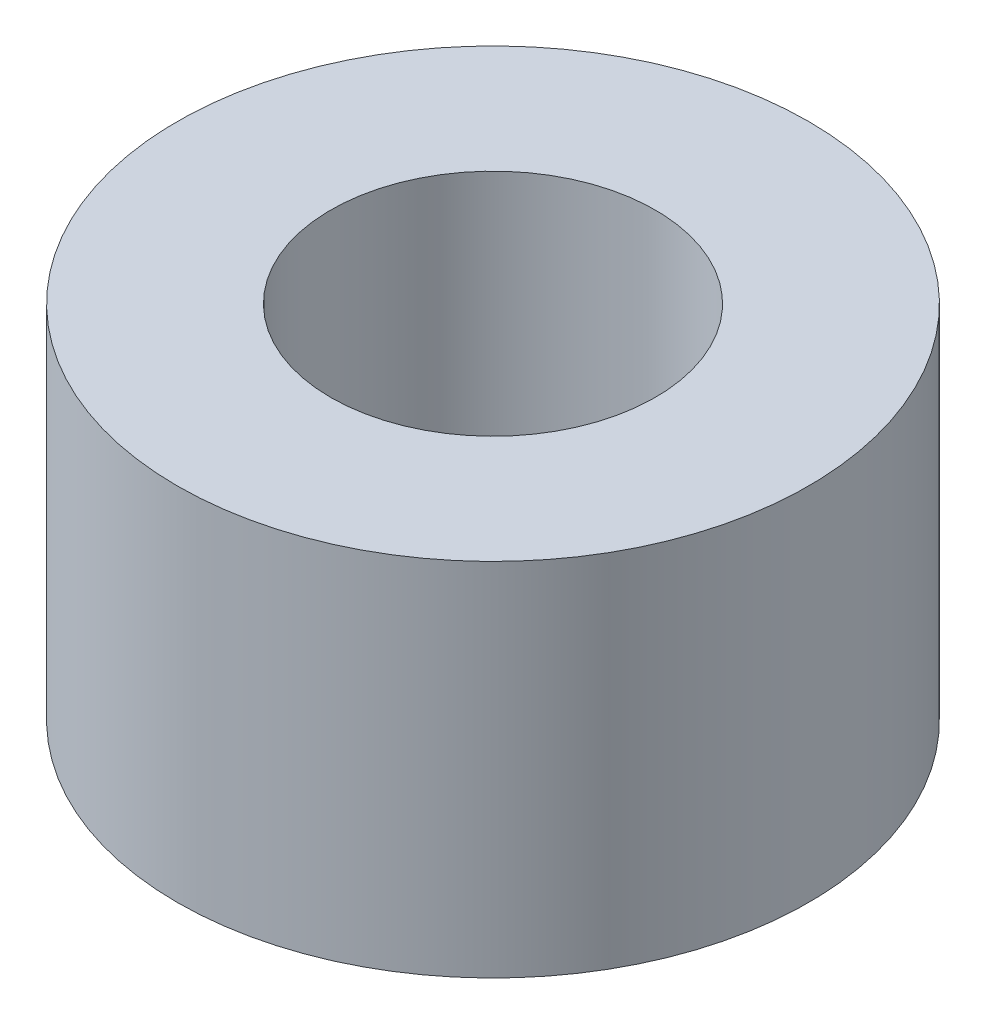
ISO-10303-21;
HEADER;
FILE_DESCRIPTION(('STEP AP214'),'2;1');
FILE_NAME('part.step','',(''),(''),'','','');
FILE_SCHEMA(('AUTOMOTIVE_DESIGN { 1 0 10303 214 1 1 1 1 }'));
ENDSEC;
DATA;
#1=APPLICATION_CONTEXT('core data for automotive mechanical design processes');
#2=APPLICATION_PROTOCOL_DEFINITION('international standard','automotive_design',2000,#1);
#3=PRODUCT_CONTEXT('',#1,'mechanical');
#4=PRODUCT('Part','Part','',(#3));
#5=PRODUCT_RELATED_PRODUCT_CATEGORY('part','',(#4));
#6=PRODUCT_DEFINITION_FORMATION('','',#4);
#7=PRODUCT_DEFINITION_CONTEXT('part definition',#1,'design');
#8=PRODUCT_DEFINITION('design','',#6,#7);
#9=PRODUCT_DEFINITION_SHAPE('','',#8);
#10=(LENGTH_UNIT() NAMED_UNIT(*) SI_UNIT(.MILLI.,.METRE.));
#11=(NAMED_UNIT(*) PLANE_ANGLE_UNIT() SI_UNIT($,.RADIAN.));
#12=(NAMED_UNIT(*) SI_UNIT($,.STERADIAN.) SOLID_ANGLE_UNIT());
#13=UNCERTAINTY_MEASURE_WITH_UNIT(LENGTH_MEASURE(1.E-05),#10,'distance_accuracy_value','');
#14=(GEOMETRIC_REPRESENTATION_CONTEXT(3) GLOBAL_UNCERTAINTY_ASSIGNED_CONTEXT((#13)) GLOBAL_UNIT_ASSIGNED_CONTEXT((#10,
#11,#12)) REPRESENTATION_CONTEXT('',''));
#15=CARTESIAN_POINT('',(0.,0.,0.));
#16=DIRECTION('',(0.,0.,1.));
#17=DIRECTION('',(1.,0.,0.));
#18=AXIS2_PLACEMENT_3D('',#15,#16,#17);
#19=CARTESIAN_POINT('',(0.,4.,0.));
#20=DIRECTION('',(0.,1.,0.));
#21=DIRECTION('',(0.,0.,1.));
#22=AXIS2_PLACEMENT_3D('',#19,#20,#21);
#23=PLANE('',#22);
#24=CARTESIAN_POINT('',(0.,4.,0.));
#25=DIRECTION('',(0.,1.,0.));
#26=DIRECTION('',(0.,0.,1.));
#27=AXIS2_PLACEMENT_3D('',#24,#25,#26);
#28=CIRCLE('',#27,3.5);
#29=CARTESIAN_POINT('',(0.,4.,3.5));
#30=VERTEX_POINT('',#29);
#31=EDGE_CURVE('E10',#30,#30,#28,.T.);
#32=ORIENTED_EDGE('',*,*,#31,.T.);
#33=EDGE_LOOP('',(#32));
#34=FACE_BOUND('',#33,.T.);
#35=CARTESIAN_POINT('',(0.,4.,0.));
#36=DIRECTION('',(0.,1.,0.));
#37=DIRECTION('',(0.,0.,1.));
#38=AXIS2_PLACEMENT_3D('',#35,#36,#37);
#39=CIRCLE('',#38,1.8);
#40=CARTESIAN_POINT('',(0.,4.,1.8));
#41=VERTEX_POINT('',#40);
#42=EDGE_CURVE('E50',#41,#41,#39,.T.);
#43=ORIENTED_EDGE('',*,*,#42,.F.);
#44=EDGE_LOOP('',(#43));
#45=FACE_BOUND('',#44,.T.);
#46=ADVANCED_FACE('F37',(#34,#45),#23,.T.);
#47=CARTESIAN_POINT('',(0.,0.,0.));
#48=DIRECTION('',(0.,1.,0.));
#49=DIRECTION('',(0.,0.,1.));
#50=AXIS2_PLACEMENT_3D('',#47,#48,#49);
#51=PLANE('',#50);
#52=CARTESIAN_POINT('',(0.,0.,0.));
#53=DIRECTION('',(0.,1.,0.));
#54=DIRECTION('',(0.,0.,1.));
#55=AXIS2_PLACEMENT_3D('',#52,#53,#54);
#56=CIRCLE('',#55,3.5);
#57=CARTESIAN_POINT('',(0.,0.,3.5));
#58=VERTEX_POINT('',#57);
#59=EDGE_CURVE('E41',#58,#58,#56,.T.);
#60=ORIENTED_EDGE('',*,*,#59,.F.);
#61=EDGE_LOOP('',(#60));
#62=FACE_BOUND('',#61,.T.);
#63=CARTESIAN_POINT('',(0.,0.,0.));
#64=DIRECTION('',(0.,1.,0.));
#65=DIRECTION('',(0.,0.,1.));
#66=AXIS2_PLACEMENT_3D('',#63,#64,#65);
#67=CIRCLE('',#66,1.8);
#68=CARTESIAN_POINT('',(0.,0.,1.8));
#69=VERTEX_POINT('',#68);
#70=EDGE_CURVE('E52',#69,#69,#67,.T.);
#71=ORIENTED_EDGE('',*,*,#70,.T.);
#72=EDGE_LOOP('',(#71));
#73=FACE_BOUND('',#72,.T.);
#74=ADVANCED_FACE('F64',(#62,#73),#51,.F.);
#75=CARTESIAN_POINT('',(0.,4.,0.));
#76=DIRECTION('',(0.,-1.,0.));
#77=DIRECTION('',(0.,0.,-1.));
#78=AXIS2_PLACEMENT_3D('',#75,#76,#77);
#79=CYLINDRICAL_SURFACE('',#78,3.5);
#80=ORIENTED_EDGE('',*,*,#31,.F.);
#81=EDGE_LOOP('',(#80));
#82=FACE_BOUND('',#81,.T.);
#83=ORIENTED_EDGE('',*,*,#59,.T.);
#84=EDGE_LOOP('',(#83));
#85=FACE_BOUND('',#84,.T.);
#86=ADVANCED_FACE('F39',(#82,#85),#79,.T.);
#87=CARTESIAN_POINT('',(0.,4.,0.));
#88=DIRECTION('',(0.,-1.,0.));
#89=DIRECTION('',(0.,0.,-1.));
#90=AXIS2_PLACEMENT_3D('',#87,#88,#89);
#91=CYLINDRICAL_SURFACE('',#90,1.8);
#92=ORIENTED_EDGE('',*,*,#42,.T.);
#93=EDGE_LOOP('',(#92));
#94=FACE_BOUND('',#93,.T.);
#95=ORIENTED_EDGE('',*,*,#70,.F.);
#96=EDGE_LOOP('',(#95));
#97=FACE_BOUND('',#96,.T.);
#98=ADVANCED_FACE('F60',(#94,#97),#91,.F.);
#99=CLOSED_SHELL('',(#46,#74,#86,#98));
#100=MANIFOLD_SOLID_BREP('B2',#99);
#101=ADVANCED_BREP_SHAPE_REPRESENTATION('',(#18,#100),#14);
#102=SHAPE_DEFINITION_REPRESENTATION(#9,#101);
ENDSEC;
END-ISO-10303-21;
